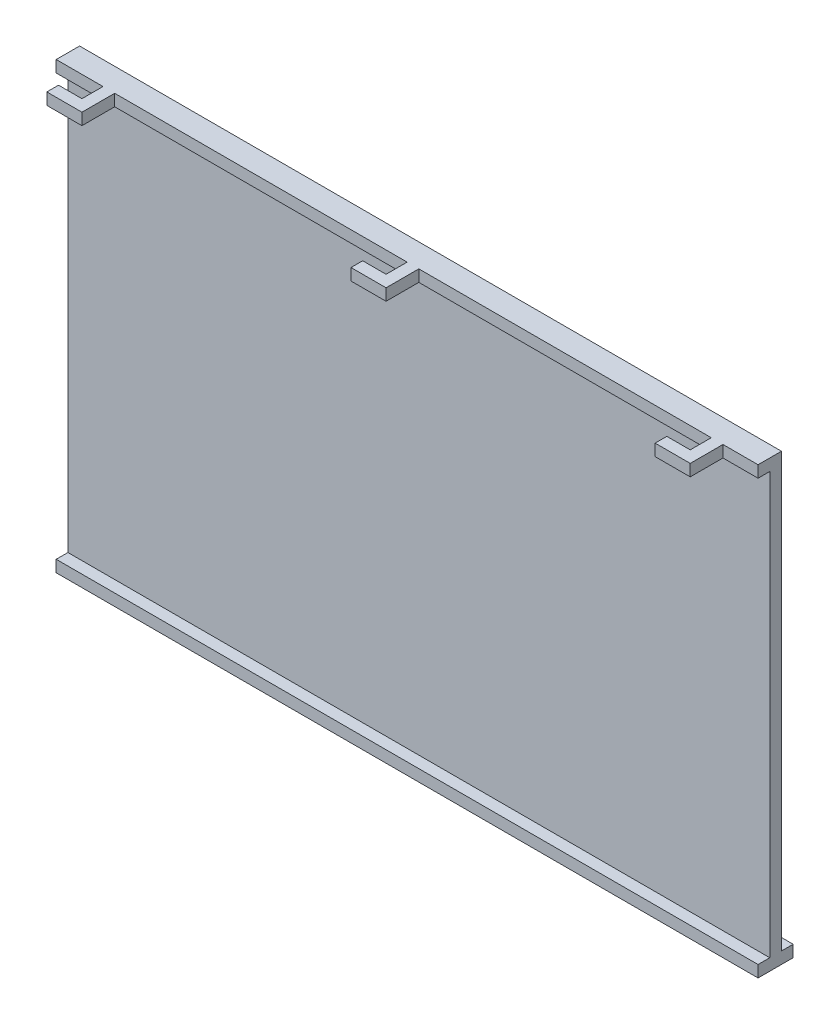
ISO-10303-21;
HEADER;
FILE_DESCRIPTION(('STEP AP214'),'2;1');
FILE_NAME('part.step','',(''),(''),'','','');
FILE_SCHEMA(('AUTOMOTIVE_DESIGN { 1 0 10303 214 1 1 1 1 }'));
ENDSEC;
DATA;
#1=APPLICATION_CONTEXT('core data for automotive mechanical design processes');
#2=APPLICATION_PROTOCOL_DEFINITION('international standard','automotive_design',2000,#1);
#3=PRODUCT_CONTEXT('',#1,'mechanical');
#4=PRODUCT('Part','Part','',(#3));
#5=PRODUCT_RELATED_PRODUCT_CATEGORY('part','',(#4));
#6=PRODUCT_DEFINITION_FORMATION('','',#4);
#7=PRODUCT_DEFINITION_CONTEXT('part definition',#1,'design');
#8=PRODUCT_DEFINITION('design','',#6,#7);
#9=PRODUCT_DEFINITION_SHAPE('','',#8);
#10=(LENGTH_UNIT() NAMED_UNIT(*) SI_UNIT(.MILLI.,.METRE.));
#11=(NAMED_UNIT(*) PLANE_ANGLE_UNIT() SI_UNIT($,.RADIAN.));
#12=(NAMED_UNIT(*) SI_UNIT($,.STERADIAN.) SOLID_ANGLE_UNIT());
#13=UNCERTAINTY_MEASURE_WITH_UNIT(LENGTH_MEASURE(1.E-05),#10,'distance_accuracy_value','');
#14=(GEOMETRIC_REPRESENTATION_CONTEXT(3) GLOBAL_UNCERTAINTY_ASSIGNED_CONTEXT((#13)) GLOBAL_UNIT_ASSIGNED_CONTEXT((#10,
#11,#12)) REPRESENTATION_CONTEXT('',''));
#15=CARTESIAN_POINT('',(0.,0.,0.));
#16=DIRECTION('',(0.,0.,1.));
#17=DIRECTION('',(1.,0.,0.));
#18=AXIS2_PLACEMENT_3D('',#15,#16,#17);
#19=CARTESIAN_POINT('',(150.,0.,7.50000000000003));
#20=DIRECTION('',(0.,0.,-1.));
#21=DIRECTION('',(-1.,0.,0.));
#22=AXIS2_PLACEMENT_3D('',#19,#20,#21);
#23=PLANE('',#22);
#24=DIRECTION('',(-1.,0.,0.));
#25=VECTOR('',#24,1.);
#26=CARTESIAN_POINT('',(150.,190.,7.50000000000003));
#27=LINE('',#26,#25);
#28=CARTESIAN_POINT('',(0.,190.,7.50000000000091));
#29=VERTEX_POINT('',#28);
#30=CARTESIAN_POINT('',(-125.,190.,7.50000000000182));
#31=VERTEX_POINT('',#30);
#32=EDGE_CURVE('E585',#29,#31,#27,.T.);
#33=ORIENTED_EDGE('',*,*,#32,.T.);
#34=DIRECTION('',(0.,1.,0.));
#35=VECTOR('',#34,1.);
#36=CARTESIAN_POINT('',(-125.,185.,7.50000000000182));
#37=LINE('',#36,#35);
#38=CARTESIAN_POINT('',(-125.,185.,7.50000000000182));
#39=VERTEX_POINT('',#38);
#40=EDGE_CURVE('E286',#39,#31,#37,.T.);
#41=ORIENTED_EDGE('',*,*,#40,.F.);
#42=DIRECTION('',(-1.,0.,0.));
#43=VECTOR('',#42,1.);
#44=CARTESIAN_POINT('',(150.,185.,7.50000000000003));
#45=LINE('',#44,#43);
#46=CARTESIAN_POINT('',(0.,185.,7.50000000000003));
#47=VERTEX_POINT('',#46);
#48=EDGE_CURVE('E580',#47,#39,#45,.T.);
#49=ORIENTED_EDGE('',*,*,#48,.F.);
#50=DIRECTION('',(0.,1.,0.));
#51=VECTOR('',#50,1.);
#52=CARTESIAN_POINT('',(0.,185.,7.50000000000091));
#53=LINE('',#52,#51);
#54=EDGE_CURVE('E331',#47,#29,#53,.T.);
#55=ORIENTED_EDGE('',*,*,#54,.T.);
#56=EDGE_LOOP('',(#33,#41,#49,#55));
#57=FACE_BOUND('',#56,.T.);
#58=ADVANCED_FACE('F81',(#57),#23,.F.);
#59=CARTESIAN_POINT('',(130.,190.,7.50000000000001));
#60=VERTEX_POINT('',#59);
#61=CARTESIAN_POINT('',(5.,190.,7.50000000000091));
#62=VERTEX_POINT('',#61);
#63=EDGE_CURVE('E517',#60,#62,#27,.T.);
#64=ORIENTED_EDGE('',*,*,#63,.T.);
#65=DIRECTION('',(0.,1.,0.));
#66=VECTOR('',#65,1.);
#67=CARTESIAN_POINT('',(5.,185.,7.50000000000091));
#68=LINE('',#67,#66);
#69=CARTESIAN_POINT('',(5.,185.,7.50000000000091));
#70=VERTEX_POINT('',#69);
#71=EDGE_CURVE('E327',#70,#62,#68,.T.);
#72=ORIENTED_EDGE('',*,*,#71,.F.);
#73=CARTESIAN_POINT('',(130.,185.,7.50000000000003));
#74=VERTEX_POINT('',#73);
#75=EDGE_CURVE('E511',#74,#70,#45,.T.);
#76=ORIENTED_EDGE('',*,*,#75,.F.);
#77=DIRECTION('',(0.,1.,0.));
#78=VECTOR('',#77,1.);
#79=CARTESIAN_POINT('',(130.,185.,7.50000000000001));
#80=LINE('',#79,#78);
#81=EDGE_CURVE('E403',#74,#60,#80,.T.);
#82=ORIENTED_EDGE('',*,*,#81,.T.);
#83=EDGE_LOOP('',(#64,#72,#76,#82));
#84=FACE_BOUND('',#83,.T.);
#85=ADVANCED_FACE('F593',(#84),#23,.F.);
#86=CARTESIAN_POINT('',(150.,190.,7.50000000000003));
#87=VERTEX_POINT('',#86);
#88=CARTESIAN_POINT('',(135.,190.,7.50000000000001));
#89=VERTEX_POINT('',#88);
#90=EDGE_CURVE('E512',#87,#89,#27,.T.);
#91=ORIENTED_EDGE('',*,*,#90,.T.);
#92=DIRECTION('',(0.,1.,0.));
#93=VECTOR('',#92,1.);
#94=CARTESIAN_POINT('',(135.,185.,7.50000000000001));
#95=LINE('',#94,#93);
#96=CARTESIAN_POINT('',(135.,185.,7.50000000000001));
#97=VERTEX_POINT('',#96);
#98=EDGE_CURVE('E422',#97,#89,#95,.T.);
#99=ORIENTED_EDGE('',*,*,#98,.F.);
#100=CARTESIAN_POINT('',(150.,185.,7.50000000000003));
#101=VERTEX_POINT('',#100);
#102=EDGE_CURVE('E506',#101,#97,#45,.T.);
#103=ORIENTED_EDGE('',*,*,#102,.F.);
#104=DIRECTION('',(0.,-1.,0.));
#105=VECTOR('',#104,1.);
#106=CARTESIAN_POINT('',(150.,0.,7.50000000000003));
#107=LINE('',#106,#105);
#108=EDGE_CURVE('E460',#87,#101,#107,.T.);
#109=ORIENTED_EDGE('',*,*,#108,.F.);
#110=EDGE_LOOP('',(#91,#99,#103,#109));
#111=FACE_BOUND('',#110,.T.);
#112=ADVANCED_FACE('F647',(#111),#23,.F.);
#113=CARTESIAN_POINT('',(150.,0.,-7.50000000000002));
#114=DIRECTION('',(0.,0.,1.));
#115=DIRECTION('',(1.,0.,0.));
#116=AXIS2_PLACEMENT_3D('',#113,#114,#115);
#117=PLANE('',#116);
#118=DIRECTION('',(0.,1.,0.));
#119=VECTOR('',#118,1.);
#120=CARTESIAN_POINT('',(-150.,0.,-7.50000000000002));
#121=LINE('',#120,#119);
#122=CARTESIAN_POINT('',(-150.,0.,-7.50000000000002));
#123=VERTEX_POINT('',#122);
#124=CARTESIAN_POINT('',(-150.,5.00000000000001,-7.50000000000002));
#125=VERTEX_POINT('',#124);
#126=EDGE_CURVE('E475',#123,#125,#121,.T.);
#127=ORIENTED_EDGE('',*,*,#126,.T.);
#128=DIRECTION('',(-1.,0.,0.));
#129=VECTOR('',#128,1.);
#130=CARTESIAN_POINT('',(150.,5.00000000000001,-7.50000000000002));
#131=LINE('',#130,#129);
#132=CARTESIAN_POINT('',(150.,5.00000000000001,-7.50000000000002));
#133=VERTEX_POINT('',#132);
#134=EDGE_CURVE('E523',#133,#125,#131,.T.);
#135=ORIENTED_EDGE('',*,*,#134,.F.);
#136=DIRECTION('',(0.,1.,0.));
#137=VECTOR('',#136,1.);
#138=CARTESIAN_POINT('',(150.,0.,-7.50000000000002));
#139=LINE('',#138,#137);
#140=CARTESIAN_POINT('',(150.,0.,-7.50000000000002));
#141=VERTEX_POINT('',#140);
#142=EDGE_CURVE('E445',#141,#133,#139,.T.);
#143=ORIENTED_EDGE('',*,*,#142,.F.);
#144=DIRECTION('',(-1.,0.,0.));
#145=VECTOR('',#144,1.);
#146=CARTESIAN_POINT('',(150.,0.,-7.50000000000002));
#147=LINE('',#146,#145);
#148=EDGE_CURVE('E91',#141,#123,#147,.T.);
#149=ORIENTED_EDGE('',*,*,#148,.T.);
#150=EDGE_LOOP('',(#127,#135,#143,#149));
#151=FACE_BOUND('',#150,.T.);
#152=ADVANCED_FACE('F561',(#151),#117,.F.);
#153=CARTESIAN_POINT('',(150.,5.,0.));
#154=DIRECTION('',(0.,1.,0.));
#155=DIRECTION('',(0.,0.,1.));
#156=AXIS2_PLACEMENT_3D('',#153,#154,#155);
#157=PLANE('',#156);
#158=DIRECTION('',(0.,0.,-1.));
#159=VECTOR('',#158,1.);
#160=CARTESIAN_POINT('',(-150.,5.,0.));
#161=LINE('',#160,#159);
#162=CARTESIAN_POINT('',(-150.,5.,-2.50000000000003));
#163=VERTEX_POINT('',#162);
#164=EDGE_CURVE('E480',#163,#125,#161,.T.);
#165=ORIENTED_EDGE('',*,*,#164,.F.);
#166=DIRECTION('',(-1.,0.,0.));
#167=VECTOR('',#166,1.);
#168=CARTESIAN_POINT('',(150.,5.,-2.50000000000003));
#169=LINE('',#168,#167);
#170=CARTESIAN_POINT('',(150.,5.,-2.50000000000003));
#171=VERTEX_POINT('',#170);
#172=EDGE_CURVE('E520',#171,#163,#169,.T.);
#173=ORIENTED_EDGE('',*,*,#172,.F.);
#174=DIRECTION('',(0.,0.,-1.));
#175=VECTOR('',#174,1.);
#176=CARTESIAN_POINT('',(150.,5.,0.));
#177=LINE('',#176,#175);
#178=EDGE_CURVE('E449',#171,#133,#177,.T.);
#179=ORIENTED_EDGE('',*,*,#178,.T.);
#180=ORIENTED_EDGE('',*,*,#134,.T.);
#181=EDGE_LOOP('',(#165,#173,#179,#180));
#182=FACE_BOUND('',#181,.T.);
#183=ADVANCED_FACE('F661',(#182),#157,.T.);
#184=CARTESIAN_POINT('',(150.,0.,-2.50000000000003));
#185=DIRECTION('',(0.,0.,1.));
#186=DIRECTION('',(0.,-1.,0.));
#187=AXIS2_PLACEMENT_3D('',#184,#185,#186);
#188=PLANE('',#187);
#189=DIRECTION('',(0.,1.,0.));
#190=VECTOR('',#189,1.);
#191=CARTESIAN_POINT('',(-150.,0.,-2.50000000000003));
#192=LINE('',#191,#190);
#193=CARTESIAN_POINT('',(-150.,190.,-2.49999999999997));
#194=VERTEX_POINT('',#193);
#195=EDGE_CURVE('E484',#163,#194,#192,.T.);
#196=ORIENTED_EDGE('',*,*,#195,.T.);
#197=DIRECTION('',(-1.,0.,0.));
#198=VECTOR('',#197,1.);
#199=CARTESIAN_POINT('',(150.,190.,-2.49999999999997));
#200=LINE('',#199,#198);
#201=CARTESIAN_POINT('',(150.,190.,-2.49999999999997));
#202=VERTEX_POINT('',#201);
#203=EDGE_CURVE('E516',#202,#194,#200,.T.);
#204=ORIENTED_EDGE('',*,*,#203,.F.);
#205=DIRECTION('',(0.,1.,0.));
#206=VECTOR('',#205,1.);
#207=CARTESIAN_POINT('',(150.,0.,-2.50000000000003));
#208=LINE('',#207,#206);
#209=EDGE_CURVE('E453',#171,#202,#208,.T.);
#210=ORIENTED_EDGE('',*,*,#209,.F.);
#211=ORIENTED_EDGE('',*,*,#172,.T.);
#212=EDGE_LOOP('',(#196,#204,#210,#211));
#213=FACE_BOUND('',#212,.T.);
#214=ADVANCED_FACE('F655',(#213),#188,.F.);
#215=CARTESIAN_POINT('',(150.,190.,0.));
#216=DIRECTION('',(0.,1.,0.));
#217=DIRECTION('',(0.,0.,1.));
#218=AXIS2_PLACEMENT_3D('',#215,#216,#217);
#219=PLANE('',#218);
#220=DIRECTION('',(0.,0.,-1.));
#221=VECTOR('',#220,1.);
#222=CARTESIAN_POINT('',(-150.,190.,0.));
#223=LINE('',#222,#221);
#224=CARTESIAN_POINT('',(-150.,190.,7.50000000000003));
#225=VERTEX_POINT('',#224);
#226=EDGE_CURVE('E488',#225,#194,#223,.T.);
#227=ORIENTED_EDGE('',*,*,#226,.F.);
#228=CARTESIAN_POINT('',(-130.,190.,7.50000000000182));
#229=VERTEX_POINT('',#228);
#230=EDGE_CURVE('E510',#229,#225,#27,.T.);
#231=ORIENTED_EDGE('',*,*,#230,.F.);
#232=DIRECTION('',(0.,0.,1.));
#233=VECTOR('',#232,1.);
#234=CARTESIAN_POINT('',(-130.,190.,16.5000000000018));
#235=LINE('',#234,#233);
#236=CARTESIAN_POINT('',(-130.,190.,16.5000000000018));
#237=VERTEX_POINT('',#236);
#238=EDGE_CURVE('E292',#229,#237,#235,.T.);
#239=ORIENTED_EDGE('',*,*,#238,.T.);
#240=DIRECTION('',(-1.,0.,0.));
#241=VECTOR('',#240,1.);
#242=CARTESIAN_POINT('',(-140.,190.,16.5000000000018));
#243=LINE('',#242,#241);
#244=CARTESIAN_POINT('',(-140.,190.,16.5000000000018));
#245=VERTEX_POINT('',#244);
#246=EDGE_CURVE('E305',#237,#245,#243,.T.);
#247=ORIENTED_EDGE('',*,*,#246,.T.);
#248=DIRECTION('',(0.,0.,1.));
#249=VECTOR('',#248,1.);
#250=CARTESIAN_POINT('',(-140.,190.,21.5000000000018));
#251=LINE('',#250,#249);
#252=CARTESIAN_POINT('',(-140.,190.,21.5000000000018));
#253=VERTEX_POINT('',#252);
#254=EDGE_CURVE('E299',#245,#253,#251,.T.);
#255=ORIENTED_EDGE('',*,*,#254,.T.);
#256=DIRECTION('',(1.,0.,0.));
#257=VECTOR('',#256,1.);
#258=CARTESIAN_POINT('',(-125.,190.,21.5000000000018));
#259=LINE('',#258,#257);
#260=CARTESIAN_POINT('',(-125.,190.,21.5000000000018));
#261=VERTEX_POINT('',#260);
#262=EDGE_CURVE('E274',#253,#261,#259,.T.);
#263=ORIENTED_EDGE('',*,*,#262,.T.);
#264=DIRECTION('',(0.,0.,-1.));
#265=VECTOR('',#264,1.);
#266=CARTESIAN_POINT('',(-125.,190.,7.50000000000182));
#267=LINE('',#266,#265);
#268=EDGE_CURVE('E283',#261,#31,#267,.T.);
#269=ORIENTED_EDGE('',*,*,#268,.T.);
#270=ORIENTED_EDGE('',*,*,#32,.F.);
#271=DIRECTION('',(0.,0.,1.));
#272=VECTOR('',#271,1.);
#273=CARTESIAN_POINT('',(0.,190.,16.5000000000009));
#274=LINE('',#273,#272);
#275=CARTESIAN_POINT('',(0.,190.,16.5000000000009));
#276=VERTEX_POINT('',#275);
#277=EDGE_CURVE('E359',#29,#276,#274,.T.);
#278=ORIENTED_EDGE('',*,*,#277,.T.);
#279=DIRECTION('',(-1.,0.,0.));
#280=VECTOR('',#279,1.);
#281=CARTESIAN_POINT('',(-9.99999999999999,190.,16.5000000000009));
#282=LINE('',#281,#280);
#283=CARTESIAN_POINT('',(-9.99999999999999,190.,16.5000000000009));
#284=VERTEX_POINT('',#283);
#285=EDGE_CURVE('E355',#276,#284,#282,.T.);
#286=ORIENTED_EDGE('',*,*,#285,.T.);
#287=DIRECTION('',(0.,0.,1.));
#288=VECTOR('',#287,1.);
#289=CARTESIAN_POINT('',(-9.99999999999999,190.,21.5000000000009));
#290=LINE('',#289,#288);
#291=CARTESIAN_POINT('',(-9.99999999999999,190.,21.5000000000009));
#292=VERTEX_POINT('',#291);
#293=EDGE_CURVE('E350',#284,#292,#290,.T.);
#294=ORIENTED_EDGE('',*,*,#293,.T.);
#295=DIRECTION('',(1.,0.,0.));
#296=VECTOR('',#295,1.);
#297=CARTESIAN_POINT('',(5.,190.,21.5000000000009));
#298=LINE('',#297,#296);
#299=CARTESIAN_POINT('',(5.,190.,21.5000000000009));
#300=VERTEX_POINT('',#299);
#301=EDGE_CURVE('E346',#292,#300,#298,.T.);
#302=ORIENTED_EDGE('',*,*,#301,.T.);
#303=DIRECTION('',(0.,0.,-1.));
#304=VECTOR('',#303,1.);
#305=CARTESIAN_POINT('',(5.,190.,7.50000000000091));
#306=LINE('',#305,#304);
#307=EDGE_CURVE('E363',#300,#62,#306,.T.);
#308=ORIENTED_EDGE('',*,*,#307,.T.);
#309=ORIENTED_EDGE('',*,*,#63,.F.);
#310=DIRECTION('',(0.,0.,1.));
#311=VECTOR('',#310,1.);
#312=CARTESIAN_POINT('',(130.,190.,16.5));
#313=LINE('',#312,#311);
#314=CARTESIAN_POINT('',(130.,190.,16.5));
#315=VERTEX_POINT('',#314);
#316=EDGE_CURVE('E367',#60,#315,#313,.T.);
#317=ORIENTED_EDGE('',*,*,#316,.T.);
#318=DIRECTION('',(-1.,0.,0.));
#319=VECTOR('',#318,1.);
#320=CARTESIAN_POINT('',(120.,190.,16.5));
#321=LINE('',#320,#319);
#322=CARTESIAN_POINT('',(120.,190.,16.5));
#323=VERTEX_POINT('',#322);
#324=EDGE_CURVE('E407',#315,#323,#321,.T.);
#325=ORIENTED_EDGE('',*,*,#324,.T.);
#326=DIRECTION('',(0.,0.,1.));
#327=VECTOR('',#326,1.);
#328=CARTESIAN_POINT('',(120.,190.,21.5));
#329=LINE('',#328,#327);
#330=CARTESIAN_POINT('',(120.,190.,21.5));
#331=VERTEX_POINT('',#330);
#332=EDGE_CURVE('E411',#323,#331,#329,.T.);
#333=ORIENTED_EDGE('',*,*,#332,.T.);
#334=DIRECTION('',(1.,0.,0.));
#335=VECTOR('',#334,1.);
#336=CARTESIAN_POINT('',(135.,190.,21.5));
#337=LINE('',#336,#335);
#338=CARTESIAN_POINT('',(135.,190.,21.5));
#339=VERTEX_POINT('',#338);
#340=EDGE_CURVE('E415',#331,#339,#337,.T.);
#341=ORIENTED_EDGE('',*,*,#340,.T.);
#342=DIRECTION('',(0.,0.,-1.));
#343=VECTOR('',#342,1.);
#344=CARTESIAN_POINT('',(135.,190.,7.50000000000001));
#345=LINE('',#344,#343);
#346=EDGE_CURVE('E388',#339,#89,#345,.T.);
#347=ORIENTED_EDGE('',*,*,#346,.T.);
#348=ORIENTED_EDGE('',*,*,#90,.F.);
#349=DIRECTION('',(0.,0.,-1.));
#350=VECTOR('',#349,1.);
#351=CARTESIAN_POINT('',(150.,190.,0.));
#352=LINE('',#351,#350);
#353=EDGE_CURVE('E456',#87,#202,#352,.T.);
#354=ORIENTED_EDGE('',*,*,#353,.T.);
#355=ORIENTED_EDGE('',*,*,#203,.T.);
#356=EDGE_LOOP('',(#227,#231,#239,#247,#255,#263,#269,#270,#278,#286,#294,#302,#308,#309,#317,
#325,#333,#341,#347,#348,#354,#355));
#357=FACE_BOUND('',#356,.T.);
#358=ADVANCED_FACE('F296',(#357),#219,.T.);
#359=CARTESIAN_POINT('',(-130.,185.,7.50000000000003));
#360=VERTEX_POINT('',#359);
#361=CARTESIAN_POINT('',(-150.,185.,7.50000000000003));
#362=VERTEX_POINT('',#361);
#363=EDGE_CURVE('E505',#360,#362,#45,.T.);
#364=ORIENTED_EDGE('',*,*,#363,.F.);
#365=DIRECTION('',(0.,1.,0.));
#366=VECTOR('',#365,1.);
#367=CARTESIAN_POINT('',(-130.,185.,7.50000000000182));
#368=LINE('',#367,#366);
#369=EDGE_CURVE('E583',#360,#229,#368,.T.);
#370=ORIENTED_EDGE('',*,*,#369,.T.);
#371=ORIENTED_EDGE('',*,*,#230,.T.);
#372=DIRECTION('',(0.,-1.,0.));
#373=VECTOR('',#372,1.);
#374=CARTESIAN_POINT('',(-150.,0.,7.50000000000003));
#375=LINE('',#374,#373);
#376=EDGE_CURVE('E492',#225,#362,#375,.T.);
#377=ORIENTED_EDGE('',*,*,#376,.T.);
#378=EDGE_LOOP('',(#364,#370,#371,#377));
#379=FACE_BOUND('',#378,.T.);
#380=ADVANCED_FACE('F581',(#379),#23,.F.);
#381=CARTESIAN_POINT('',(150.,185.,0.));
#382=DIRECTION('',(0.,-1.,0.));
#383=DIRECTION('',(0.,0.,-1.));
#384=AXIS2_PLACEMENT_3D('',#381,#382,#383);
#385=PLANE('',#384);
#386=DIRECTION('',(0.,0.,1.));
#387=VECTOR('',#386,1.);
#388=CARTESIAN_POINT('',(-150.,185.,0.));
#389=LINE('',#388,#387);
#390=CARTESIAN_POINT('',(-150.,185.,2.50000000000003));
#391=VERTEX_POINT('',#390);
#392=EDGE_CURVE('E496',#391,#362,#389,.T.);
#393=ORIENTED_EDGE('',*,*,#392,.F.);
#394=DIRECTION('',(-1.,0.,0.));
#395=VECTOR('',#394,1.);
#396=CARTESIAN_POINT('',(150.,185.,2.50000000000003));
#397=LINE('',#396,#395);
#398=CARTESIAN_POINT('',(150.,185.,2.50000000000003));
#399=VERTEX_POINT('',#398);
#400=EDGE_CURVE('E470',#399,#391,#397,.T.);
#401=ORIENTED_EDGE('',*,*,#400,.F.);
#402=DIRECTION('',(0.,0.,1.));
#403=VECTOR('',#402,1.);
#404=CARTESIAN_POINT('',(150.,185.,0.));
#405=LINE('',#404,#403);
#406=EDGE_CURVE('E463',#399,#101,#405,.T.);
#407=ORIENTED_EDGE('',*,*,#406,.T.);
#408=ORIENTED_EDGE('',*,*,#102,.T.);
#409=DIRECTION('',(0.,0.,-1.));
#410=VECTOR('',#409,1.);
#411=CARTESIAN_POINT('',(135.,185.,7.50000000000001));
#412=LINE('',#411,#410);
#413=CARTESIAN_POINT('',(135.,185.,21.5));
#414=VERTEX_POINT('',#413);
#415=EDGE_CURVE('E400',#414,#97,#412,.T.);
#416=ORIENTED_EDGE('',*,*,#415,.F.);
#417=DIRECTION('',(1.,0.,0.));
#418=VECTOR('',#417,1.);
#419=CARTESIAN_POINT('',(135.,185.,21.5));
#420=LINE('',#419,#418);
#421=CARTESIAN_POINT('',(120.,185.,21.5));
#422=VERTEX_POINT('',#421);
#423=EDGE_CURVE('E396',#422,#414,#420,.T.);
#424=ORIENTED_EDGE('',*,*,#423,.F.);
#425=DIRECTION('',(0.,0.,1.));
#426=VECTOR('',#425,1.);
#427=CARTESIAN_POINT('',(120.,185.,21.5));
#428=LINE('',#427,#426);
#429=CARTESIAN_POINT('',(120.,185.,16.5));
#430=VERTEX_POINT('',#429);
#431=EDGE_CURVE('E392',#430,#422,#428,.T.);
#432=ORIENTED_EDGE('',*,*,#431,.F.);
#433=DIRECTION('',(-1.,0.,0.));
#434=VECTOR('',#433,1.);
#435=CARTESIAN_POINT('',(120.,185.,16.5));
#436=LINE('',#435,#434);
#437=CARTESIAN_POINT('',(130.,185.,16.5));
#438=VERTEX_POINT('',#437);
#439=EDGE_CURVE('E387',#438,#430,#436,.T.);
#440=ORIENTED_EDGE('',*,*,#439,.F.);
#441=DIRECTION('',(0.,0.,1.));
#442=VECTOR('',#441,1.);
#443=CARTESIAN_POINT('',(130.,185.,16.5));
#444=LINE('',#443,#442);
#445=EDGE_CURVE('E383',#74,#438,#444,.T.);
#446=ORIENTED_EDGE('',*,*,#445,.F.);
#447=ORIENTED_EDGE('',*,*,#75,.T.);
#448=DIRECTION('',(0.,0.,-1.));
#449=VECTOR('',#448,1.);
#450=CARTESIAN_POINT('',(5.,185.,7.50000000000091));
#451=LINE('',#450,#449);
#452=CARTESIAN_POINT('',(5.,185.,21.5000000000009));
#453=VERTEX_POINT('',#452);
#454=EDGE_CURVE('E351',#453,#70,#451,.T.);
#455=ORIENTED_EDGE('',*,*,#454,.F.);
#456=DIRECTION('',(1.,0.,0.));
#457=VECTOR('',#456,1.);
#458=CARTESIAN_POINT('',(5.,185.,21.5000000000009));
#459=LINE('',#458,#457);
#460=CARTESIAN_POINT('',(-9.99999999999999,185.,21.5000000000009));
#461=VERTEX_POINT('',#460);
#462=EDGE_CURVE('E330',#461,#453,#459,.T.);
#463=ORIENTED_EDGE('',*,*,#462,.F.);
#464=DIRECTION('',(0.,0.,1.));
#465=VECTOR('',#464,1.);
#466=CARTESIAN_POINT('',(-9.99999999999999,185.,21.5000000000009));
#467=LINE('',#466,#465);
#468=CARTESIAN_POINT('',(-9.99999999999999,185.,16.5000000000009));
#469=VERTEX_POINT('',#468);
#470=EDGE_CURVE('E371',#469,#461,#467,.T.);
#471=ORIENTED_EDGE('',*,*,#470,.F.);
#472=DIRECTION('',(-1.,0.,0.));
#473=VECTOR('',#472,1.);
#474=CARTESIAN_POINT('',(-9.99999999999999,185.,16.5000000000009));
#475=LINE('',#474,#473);
#476=CARTESIAN_POINT('',(0.,185.,16.5000000000009));
#477=VERTEX_POINT('',#476);
#478=EDGE_CURVE('E375',#477,#469,#475,.T.);
#479=ORIENTED_EDGE('',*,*,#478,.F.);
#480=DIRECTION('',(0.,0.,1.));
#481=VECTOR('',#480,1.);
#482=CARTESIAN_POINT('',(0.,185.,16.5000000000009));
#483=LINE('',#482,#481);
#484=EDGE_CURVE('E106',#47,#477,#483,.T.);
#485=ORIENTED_EDGE('',*,*,#484,.F.);
#486=ORIENTED_EDGE('',*,*,#48,.T.);
#487=DIRECTION('',(0.,0.,-1.));
#488=VECTOR('',#487,1.);
#489=CARTESIAN_POINT('',(-125.,185.,7.50000000000182));
#490=LINE('',#489,#488);
#491=CARTESIAN_POINT('',(-125.,185.,21.5000000000018));
#492=VERTEX_POINT('',#491);
#493=EDGE_CURVE('E301',#492,#39,#490,.T.);
#494=ORIENTED_EDGE('',*,*,#493,.F.);
#495=DIRECTION('',(1.,0.,0.));
#496=VECTOR('',#495,1.);
#497=CARTESIAN_POINT('',(-125.,185.,21.5000000000018));
#498=LINE('',#497,#496);
#499=CARTESIAN_POINT('',(-140.,185.,21.5000000000018));
#500=VERTEX_POINT('',#499);
#501=EDGE_CURVE('E276',#500,#492,#498,.T.);
#502=ORIENTED_EDGE('',*,*,#501,.F.);
#503=DIRECTION('',(0.,0.,1.));
#504=VECTOR('',#503,1.);
#505=CARTESIAN_POINT('',(-140.,185.,21.5000000000018));
#506=LINE('',#505,#504);
#507=CARTESIAN_POINT('',(-140.,185.,16.5000000000018));
#508=VERTEX_POINT('',#507);
#509=EDGE_CURVE('E317',#508,#500,#506,.T.);
#510=ORIENTED_EDGE('',*,*,#509,.F.);
#511=DIRECTION('',(-1.,0.,0.));
#512=VECTOR('',#511,1.);
#513=CARTESIAN_POINT('',(-140.,185.,16.5000000000018));
#514=LINE('',#513,#512);
#515=CARTESIAN_POINT('',(-130.,185.,16.5000000000018));
#516=VERTEX_POINT('',#515);
#517=EDGE_CURVE('E321',#516,#508,#514,.T.);
#518=ORIENTED_EDGE('',*,*,#517,.F.);
#519=DIRECTION('',(0.,0.,1.));
#520=VECTOR('',#519,1.);
#521=CARTESIAN_POINT('',(-130.,185.,16.5000000000018));
#522=LINE('',#521,#520);
#523=EDGE_CURVE('E99',#360,#516,#522,.T.);
#524=ORIENTED_EDGE('',*,*,#523,.F.);
#525=ORIENTED_EDGE('',*,*,#363,.T.);
#526=EDGE_LOOP('',(#393,#401,#407,#408,#416,#424,#432,#440,#446,#447,#455,#463,#471,#479,#485,
#486,#494,#502,#510,#518,#524,#525));
#527=FACE_BOUND('',#526,.T.);
#528=ADVANCED_FACE('F575',(#527),#385,.T.);
#529=CARTESIAN_POINT('',(150.,0.,2.5));
#530=DIRECTION('',(0.,0.,1.));
#531=DIRECTION('',(0.,-1.,0.));
#532=AXIS2_PLACEMENT_3D('',#529,#530,#531);
#533=PLANE('',#532);
#534=DIRECTION('',(0.,1.,0.));
#535=VECTOR('',#534,1.);
#536=CARTESIAN_POINT('',(-150.,0.,2.5));
#537=LINE('',#536,#535);
#538=CARTESIAN_POINT('',(-150.,5.,2.5));
#539=VERTEX_POINT('',#538);
#540=EDGE_CURVE('E446',#539,#391,#537,.T.);
#541=ORIENTED_EDGE('',*,*,#540,.F.);
#542=DIRECTION('',(1.,0.,0.));
#543=VECTOR('',#542,1.);
#544=CARTESIAN_POINT('',(150.,5.,2.5));
#545=LINE('',#544,#543);
#546=CARTESIAN_POINT('',(150.,5.,2.5));
#547=VERTEX_POINT('',#546);
#548=EDGE_CURVE('E12',#539,#547,#545,.T.);
#549=ORIENTED_EDGE('',*,*,#548,.T.);
#550=DIRECTION('',(0.,1.,0.));
#551=VECTOR('',#550,1.);
#552=CARTESIAN_POINT('',(150.,0.,2.5));
#553=LINE('',#552,#551);
#554=EDGE_CURVE('E467',#547,#399,#553,.T.);
#555=ORIENTED_EDGE('',*,*,#554,.T.);
#556=ORIENTED_EDGE('',*,*,#400,.T.);
#557=EDGE_LOOP('',(#541,#549,#555,#556));
#558=FACE_BOUND('',#557,.T.);
#559=ADVANCED_FACE('F571',(#558),#533,.T.);
#560=CARTESIAN_POINT('',(150.,0.,0.));
#561=DIRECTION('',(0.,1.,0.));
#562=DIRECTION('',(0.,0.,1.));
#563=AXIS2_PLACEMENT_3D('',#560,#561,#562);
#564=PLANE('',#563);
#565=DIRECTION('',(0.,0.,-1.));
#566=VECTOR('',#565,1.);
#567=CARTESIAN_POINT('',(-150.,0.,0.));
#568=LINE('',#567,#566);
#569=CARTESIAN_POINT('',(-150.,0.,7.5));
#570=VERTEX_POINT('',#569);
#571=EDGE_CURVE('E471',#570,#123,#568,.T.);
#572=ORIENTED_EDGE('',*,*,#571,.T.);
#573=ORIENTED_EDGE('',*,*,#148,.F.);
#574=DIRECTION('',(0.,0.,-1.));
#575=VECTOR('',#574,1.);
#576=CARTESIAN_POINT('',(150.,0.,0.));
#577=LINE('',#576,#575);
#578=CARTESIAN_POINT('',(150.,0.,7.5));
#579=VERTEX_POINT('',#578);
#580=EDGE_CURVE('E441',#579,#141,#577,.T.);
#581=ORIENTED_EDGE('',*,*,#580,.F.);
#582=DIRECTION('',(-1.,0.,0.));
#583=VECTOR('',#582,1.);
#584=CARTESIAN_POINT('',(150.,0.,7.5));
#585=LINE('',#584,#583);
#586=EDGE_CURVE('E85',#579,#570,#585,.T.);
#587=ORIENTED_EDGE('',*,*,#586,.T.);
#588=EDGE_LOOP('',(#572,#573,#581,#587));
#589=FACE_BOUND('',#588,.T.);
#590=ADVANCED_FACE('F550',(#589),#564,.F.);
#591=CARTESIAN_POINT('',(-150.,0.,0.));
#592=DIRECTION('',(1.,0.,0.));
#593=DIRECTION('',(0.,0.,-1.));
#594=AXIS2_PLACEMENT_3D('',#591,#592,#593);
#595=PLANE('',#594);
#596=ORIENTED_EDGE('',*,*,#571,.F.);
#597=DIRECTION('',(0.,1.,0.));
#598=VECTOR('',#597,1.);
#599=CARTESIAN_POINT('',(-150.,0.,7.5));
#600=LINE('',#599,#598);
#601=CARTESIAN_POINT('',(-150.,5.,7.5));
#602=VERTEX_POINT('',#601);
#603=EDGE_CURVE('E425',#570,#602,#600,.T.);
#604=ORIENTED_EDGE('',*,*,#603,.T.);
#605=DIRECTION('',(0.,0.,1.));
#606=VECTOR('',#605,1.);
#607=CARTESIAN_POINT('',(-150.,5.,2.5));
#608=LINE('',#607,#606);
#609=EDGE_CURVE('E534',#539,#602,#608,.T.);
#610=ORIENTED_EDGE('',*,*,#609,.F.);
#611=ORIENTED_EDGE('',*,*,#540,.T.);
#612=ORIENTED_EDGE('',*,*,#392,.T.);
#613=ORIENTED_EDGE('',*,*,#376,.F.);
#614=ORIENTED_EDGE('',*,*,#226,.T.);
#615=ORIENTED_EDGE('',*,*,#195,.F.);
#616=ORIENTED_EDGE('',*,*,#164,.T.);
#617=ORIENTED_EDGE('',*,*,#126,.F.);
#618=EDGE_LOOP('',(#596,#604,#610,#611,#612,#613,#614,#615,#616,#617));
#619=FACE_BOUND('',#618,.T.);
#620=ADVANCED_FACE('F555',(#619),#595,.F.);
#621=CARTESIAN_POINT('',(150.,0.,0.));
#622=DIRECTION('',(1.,0.,0.));
#623=DIRECTION('',(0.,0.,-1.));
#624=AXIS2_PLACEMENT_3D('',#621,#622,#623);
#625=PLANE('',#624);
#626=ORIENTED_EDGE('',*,*,#580,.T.);
#627=ORIENTED_EDGE('',*,*,#142,.T.);
#628=ORIENTED_EDGE('',*,*,#178,.F.);
#629=ORIENTED_EDGE('',*,*,#209,.T.);
#630=ORIENTED_EDGE('',*,*,#353,.F.);
#631=ORIENTED_EDGE('',*,*,#108,.T.);
#632=ORIENTED_EDGE('',*,*,#406,.F.);
#633=ORIENTED_EDGE('',*,*,#554,.F.);
#634=DIRECTION('',(0.,0.,1.));
#635=VECTOR('',#634,1.);
#636=CARTESIAN_POINT('',(150.,5.,2.5));
#637=LINE('',#636,#635);
#638=CARTESIAN_POINT('',(150.,5.,7.5));
#639=VERTEX_POINT('',#638);
#640=EDGE_CURVE('E533',#547,#639,#637,.T.);
#641=ORIENTED_EDGE('',*,*,#640,.T.);
#642=DIRECTION('',(0.,1.,0.));
#643=VECTOR('',#642,1.);
#644=CARTESIAN_POINT('',(150.,0.,7.5));
#645=LINE('',#644,#643);
#646=EDGE_CURVE('E529',#579,#639,#645,.T.);
#647=ORIENTED_EDGE('',*,*,#646,.F.);
#648=EDGE_LOOP('',(#626,#627,#628,#629,#630,#631,#632,#633,#641,#647));
#649=FACE_BOUND('',#648,.T.);
#650=ADVANCED_FACE('F564',(#649),#625,.T.);
#651=CARTESIAN_POINT('',(150.,5.,2.5));
#652=DIRECTION('',(0.,-1.,0.));
#653=DIRECTION('',(0.,0.,-1.));
#654=AXIS2_PLACEMENT_3D('',#651,#652,#653);
#655=PLANE('',#654);
#656=ORIENTED_EDGE('',*,*,#609,.T.);
#657=DIRECTION('',(-1.,0.,0.));
#658=VECTOR('',#657,1.);
#659=CARTESIAN_POINT('',(150.,5.,7.5));
#660=LINE('',#659,#658);
#661=EDGE_CURVE('E476',#639,#602,#660,.T.);
#662=ORIENTED_EDGE('',*,*,#661,.F.);
#663=ORIENTED_EDGE('',*,*,#640,.F.);
#664=ORIENTED_EDGE('',*,*,#548,.F.);
#665=EDGE_LOOP('',(#656,#662,#663,#664));
#666=FACE_BOUND('',#665,.T.);
#667=ADVANCED_FACE('F569',(#666),#655,.F.);
#668=CARTESIAN_POINT('',(150.,0.,7.5));
#669=DIRECTION('',(0.,0.,1.));
#670=DIRECTION('',(1.,0.,0.));
#671=AXIS2_PLACEMENT_3D('',#668,#669,#670);
#672=PLANE('',#671);
#673=ORIENTED_EDGE('',*,*,#603,.F.);
#674=ORIENTED_EDGE('',*,*,#586,.F.);
#675=ORIENTED_EDGE('',*,*,#646,.T.);
#676=ORIENTED_EDGE('',*,*,#661,.T.);
#677=EDGE_LOOP('',(#673,#674,#675,#676));
#678=FACE_BOUND('',#677,.T.);
#679=ADVANCED_FACE('F83',(#678),#672,.T.);
#680=CARTESIAN_POINT('',(135.,185.,7.50000000000001));
#681=DIRECTION('',(1.,0.,0.));
#682=DIRECTION('',(0.,0.,-1.));
#683=AXIS2_PLACEMENT_3D('',#680,#681,#682);
#684=PLANE('',#683);
#685=ORIENTED_EDGE('',*,*,#346,.F.);
#686=DIRECTION('',(0.,1.,0.));
#687=VECTOR('',#686,1.);
#688=CARTESIAN_POINT('',(135.,185.,21.5));
#689=LINE('',#688,#687);
#690=EDGE_CURVE('E426',#414,#339,#689,.T.);
#691=ORIENTED_EDGE('',*,*,#690,.F.);
#692=ORIENTED_EDGE('',*,*,#415,.T.);
#693=ORIENTED_EDGE('',*,*,#98,.T.);
#694=EDGE_LOOP('',(#685,#691,#692,#693));
#695=FACE_BOUND('',#694,.T.);
#696=ADVANCED_FACE('F670',(#695),#684,.T.);
#697=CARTESIAN_POINT('',(135.,185.,21.5));
#698=DIRECTION('',(0.,0.,1.));
#699=DIRECTION('',(1.,0.,0.));
#700=AXIS2_PLACEMENT_3D('',#697,#698,#699);
#701=PLANE('',#700);
#702=ORIENTED_EDGE('',*,*,#340,.F.);
#703=DIRECTION('',(0.,1.,0.));
#704=VECTOR('',#703,1.);
#705=CARTESIAN_POINT('',(120.,185.,21.5));
#706=LINE('',#705,#704);
#707=EDGE_CURVE('E429',#422,#331,#706,.T.);
#708=ORIENTED_EDGE('',*,*,#707,.F.);
#709=ORIENTED_EDGE('',*,*,#423,.T.);
#710=ORIENTED_EDGE('',*,*,#690,.T.);
#711=EDGE_LOOP('',(#702,#708,#709,#710));
#712=FACE_BOUND('',#711,.T.);
#713=ADVANCED_FACE('F777',(#712),#701,.T.);
#714=CARTESIAN_POINT('',(120.,185.,21.5));
#715=DIRECTION('',(-1.,0.,0.));
#716=DIRECTION('',(0.,0.,1.));
#717=AXIS2_PLACEMENT_3D('',#714,#715,#716);
#718=PLANE('',#717);
#719=ORIENTED_EDGE('',*,*,#332,.F.);
#720=DIRECTION('',(0.,1.,0.));
#721=VECTOR('',#720,1.);
#722=CARTESIAN_POINT('',(120.,185.,16.5));
#723=LINE('',#722,#721);
#724=EDGE_CURVE('E432',#430,#323,#723,.T.);
#725=ORIENTED_EDGE('',*,*,#724,.F.);
#726=ORIENTED_EDGE('',*,*,#431,.T.);
#727=ORIENTED_EDGE('',*,*,#707,.T.);
#728=EDGE_LOOP('',(#719,#725,#726,#727));
#729=FACE_BOUND('',#728,.T.);
#730=ADVANCED_FACE('F786',(#729),#718,.T.);
#731=CARTESIAN_POINT('',(120.,185.,16.5));
#732=DIRECTION('',(0.,0.,-1.));
#733=DIRECTION('',(-1.,0.,0.));
#734=AXIS2_PLACEMENT_3D('',#731,#732,#733);
#735=PLANE('',#734);
#736=ORIENTED_EDGE('',*,*,#324,.F.);
#737=DIRECTION('',(0.,1.,0.));
#738=VECTOR('',#737,1.);
#739=CARTESIAN_POINT('',(130.,185.,16.5));
#740=LINE('',#739,#738);
#741=EDGE_CURVE('E435',#438,#315,#740,.T.);
#742=ORIENTED_EDGE('',*,*,#741,.F.);
#743=ORIENTED_EDGE('',*,*,#439,.T.);
#744=ORIENTED_EDGE('',*,*,#724,.T.);
#745=EDGE_LOOP('',(#736,#742,#743,#744));
#746=FACE_BOUND('',#745,.T.);
#747=ADVANCED_FACE('F797',(#746),#735,.T.);
#748=CARTESIAN_POINT('',(130.,185.,16.5));
#749=DIRECTION('',(-1.,0.,0.));
#750=DIRECTION('',(0.,0.,1.));
#751=AXIS2_PLACEMENT_3D('',#748,#749,#750);
#752=PLANE('',#751);
#753=ORIENTED_EDGE('',*,*,#316,.F.);
#754=ORIENTED_EDGE('',*,*,#81,.F.);
#755=ORIENTED_EDGE('',*,*,#445,.T.);
#756=ORIENTED_EDGE('',*,*,#741,.T.);
#757=EDGE_LOOP('',(#753,#754,#755,#756));
#758=FACE_BOUND('',#757,.T.);
#759=ADVANCED_FACE('F697',(#758),#752,.T.);
#760=CARTESIAN_POINT('',(5.,185.,7.50000000000091));
#761=DIRECTION('',(1.,0.,0.));
#762=DIRECTION('',(0.,0.,-1.));
#763=AXIS2_PLACEMENT_3D('',#760,#761,#762);
#764=PLANE('',#763);
#765=ORIENTED_EDGE('',*,*,#307,.F.);
#766=DIRECTION('',(0.,1.,0.));
#767=VECTOR('',#766,1.);
#768=CARTESIAN_POINT('',(5.,185.,21.5000000000009));
#769=LINE('',#768,#767);
#770=EDGE_CURVE('E291',#453,#300,#769,.T.);
#771=ORIENTED_EDGE('',*,*,#770,.F.);
#772=ORIENTED_EDGE('',*,*,#454,.T.);
#773=ORIENTED_EDGE('',*,*,#71,.T.);
#774=EDGE_LOOP('',(#765,#771,#772,#773));
#775=FACE_BOUND('',#774,.T.);
#776=ADVANCED_FACE('F600',(#775),#764,.T.);
#777=CARTESIAN_POINT('',(5.,185.,21.5000000000009));
#778=DIRECTION('',(0.,0.,1.));
#779=DIRECTION('',(1.,0.,0.));
#780=AXIS2_PLACEMENT_3D('',#777,#778,#779);
#781=PLANE('',#780);
#782=ORIENTED_EDGE('',*,*,#301,.F.);
#783=DIRECTION('',(0.,1.,0.));
#784=VECTOR('',#783,1.);
#785=CARTESIAN_POINT('',(-9.99999999999999,185.,21.5000000000009));
#786=LINE('',#785,#784);
#787=EDGE_CURVE('E341',#461,#292,#786,.T.);
#788=ORIENTED_EDGE('',*,*,#787,.F.);
#789=ORIENTED_EDGE('',*,*,#462,.T.);
#790=ORIENTED_EDGE('',*,*,#770,.T.);
#791=EDGE_LOOP('',(#782,#788,#789,#790));
#792=FACE_BOUND('',#791,.T.);
#793=ADVANCED_FACE('F605',(#792),#781,.T.);
#794=CARTESIAN_POINT('',(-9.99999999999999,185.,21.5000000000009));
#795=DIRECTION('',(-1.,0.,0.));
#796=DIRECTION('',(0.,0.,1.));
#797=AXIS2_PLACEMENT_3D('',#794,#795,#796);
#798=PLANE('',#797);
#799=ORIENTED_EDGE('',*,*,#293,.F.);
#800=DIRECTION('',(0.,1.,0.));
#801=VECTOR('',#800,1.);
#802=CARTESIAN_POINT('',(-9.99999999999999,185.,16.5000000000009));
#803=LINE('',#802,#801);
#804=EDGE_CURVE('E338',#469,#284,#803,.T.);
#805=ORIENTED_EDGE('',*,*,#804,.F.);
#806=ORIENTED_EDGE('',*,*,#470,.T.);
#807=ORIENTED_EDGE('',*,*,#787,.T.);
#808=EDGE_LOOP('',(#799,#805,#806,#807));
#809=FACE_BOUND('',#808,.T.);
#810=ADVANCED_FACE('F608',(#809),#798,.T.);
#811=CARTESIAN_POINT('',(-9.99999999999999,185.,16.5000000000009));
#812=DIRECTION('',(0.,0.,-1.));
#813=DIRECTION('',(-1.,0.,0.));
#814=AXIS2_PLACEMENT_3D('',#811,#812,#813);
#815=PLANE('',#814);
#816=ORIENTED_EDGE('',*,*,#285,.F.);
#817=DIRECTION('',(0.,1.,0.));
#818=VECTOR('',#817,1.);
#819=CARTESIAN_POINT('',(0.,185.,16.5000000000009));
#820=LINE('',#819,#818);
#821=EDGE_CURVE('E335',#477,#276,#820,.T.);
#822=ORIENTED_EDGE('',*,*,#821,.F.);
#823=ORIENTED_EDGE('',*,*,#478,.T.);
#824=ORIENTED_EDGE('',*,*,#804,.T.);
#825=EDGE_LOOP('',(#816,#822,#823,#824));
#826=FACE_BOUND('',#825,.T.);
#827=ADVANCED_FACE('F611',(#826),#815,.T.);
#828=CARTESIAN_POINT('',(0.,185.,16.5000000000009));
#829=DIRECTION('',(-1.,0.,0.));
#830=DIRECTION('',(0.,0.,1.));
#831=AXIS2_PLACEMENT_3D('',#828,#829,#830);
#832=PLANE('',#831);
#833=ORIENTED_EDGE('',*,*,#277,.F.);
#834=ORIENTED_EDGE('',*,*,#54,.F.);
#835=ORIENTED_EDGE('',*,*,#484,.T.);
#836=ORIENTED_EDGE('',*,*,#821,.T.);
#837=EDGE_LOOP('',(#833,#834,#835,#836));
#838=FACE_BOUND('',#837,.T.);
#839=ADVANCED_FACE('F613',(#838),#832,.T.);
#840=CARTESIAN_POINT('',(-125.,185.,7.50000000000182));
#841=DIRECTION('',(1.,0.,0.));
#842=DIRECTION('',(0.,0.,-1.));
#843=AXIS2_PLACEMENT_3D('',#840,#841,#842);
#844=PLANE('',#843);
#845=ORIENTED_EDGE('',*,*,#268,.F.);
#846=DIRECTION('',(0.,1.,0.));
#847=VECTOR('',#846,1.);
#848=CARTESIAN_POINT('',(-125.,185.,21.5000000000018));
#849=LINE('',#848,#847);
#850=EDGE_CURVE('E270',#492,#261,#849,.T.);
#851=ORIENTED_EDGE('',*,*,#850,.F.);
#852=ORIENTED_EDGE('',*,*,#493,.T.);
#853=ORIENTED_EDGE('',*,*,#40,.T.);
#854=EDGE_LOOP('',(#845,#851,#852,#853));
#855=FACE_BOUND('',#854,.T.);
#856=ADVANCED_FACE('F284',(#855),#844,.T.);
#857=CARTESIAN_POINT('',(-125.,185.,21.5000000000018));
#858=DIRECTION('',(0.,0.,1.));
#859=DIRECTION('',(1.,0.,0.));
#860=AXIS2_PLACEMENT_3D('',#857,#858,#859);
#861=PLANE('',#860);
#862=ORIENTED_EDGE('',*,*,#262,.F.);
#863=DIRECTION('',(0.,1.,0.));
#864=VECTOR('',#863,1.);
#865=CARTESIAN_POINT('',(-140.,185.,21.5000000000018));
#866=LINE('',#865,#864);
#867=EDGE_CURVE('E280',#500,#253,#866,.T.);
#868=ORIENTED_EDGE('',*,*,#867,.F.);
#869=ORIENTED_EDGE('',*,*,#501,.T.);
#870=ORIENTED_EDGE('',*,*,#850,.T.);
#871=EDGE_LOOP('',(#862,#868,#869,#870));
#872=FACE_BOUND('',#871,.T.);
#873=ADVANCED_FACE('F272',(#872),#861,.T.);
#874=CARTESIAN_POINT('',(-140.,185.,21.5000000000018));
#875=DIRECTION('',(-1.,0.,0.));
#876=DIRECTION('',(0.,0.,1.));
#877=AXIS2_PLACEMENT_3D('',#874,#875,#876);
#878=PLANE('',#877);
#879=ORIENTED_EDGE('',*,*,#254,.F.);
#880=DIRECTION('',(0.,1.,0.));
#881=VECTOR('',#880,1.);
#882=CARTESIAN_POINT('',(-140.,185.,16.5000000000018));
#883=LINE('',#882,#881);
#884=EDGE_CURVE('E622',#508,#245,#883,.T.);
#885=ORIENTED_EDGE('',*,*,#884,.F.);
#886=ORIENTED_EDGE('',*,*,#509,.T.);
#887=ORIENTED_EDGE('',*,*,#867,.T.);
#888=EDGE_LOOP('',(#879,#885,#886,#887));
#889=FACE_BOUND('',#888,.T.);
#890=ADVANCED_FACE('F633',(#889),#878,.T.);
#891=CARTESIAN_POINT('',(-140.,185.,16.5000000000018));
#892=DIRECTION('',(0.,0.,-1.));
#893=DIRECTION('',(-1.,0.,0.));
#894=AXIS2_PLACEMENT_3D('',#891,#892,#893);
#895=PLANE('',#894);
#896=ORIENTED_EDGE('',*,*,#246,.F.);
#897=DIRECTION('',(0.,1.,0.));
#898=VECTOR('',#897,1.);
#899=CARTESIAN_POINT('',(-130.,185.,16.5000000000018));
#900=LINE('',#899,#898);
#901=EDGE_CURVE('E623',#516,#237,#900,.T.);
#902=ORIENTED_EDGE('',*,*,#901,.F.);
#903=ORIENTED_EDGE('',*,*,#517,.T.);
#904=ORIENTED_EDGE('',*,*,#884,.T.);
#905=EDGE_LOOP('',(#896,#902,#903,#904));
#906=FACE_BOUND('',#905,.T.);
#907=ADVANCED_FACE('F621',(#906),#895,.T.);
#908=CARTESIAN_POINT('',(-130.,185.,16.5000000000018));
#909=DIRECTION('',(-1.,0.,0.));
#910=DIRECTION('',(0.,0.,1.));
#911=AXIS2_PLACEMENT_3D('',#908,#909,#910);
#912=PLANE('',#911);
#913=ORIENTED_EDGE('',*,*,#238,.F.);
#914=ORIENTED_EDGE('',*,*,#369,.F.);
#915=ORIENTED_EDGE('',*,*,#523,.T.);
#916=ORIENTED_EDGE('',*,*,#901,.T.);
#917=EDGE_LOOP('',(#913,#914,#915,#916));
#918=FACE_BOUND('',#917,.T.);
#919=ADVANCED_FACE('F634',(#918),#912,.T.);
#920=CLOSED_SHELL('',(#58,#85,#112,#152,#183,#214,#358,#380,#528,#559,#590,#620,#650,#667,#679,
#696,#713,#730,#747,#759,#776,#793,#810,#827,#839,#856,#873,#890,#907,#919));
#921=MANIFOLD_SOLID_BREP('B2',#920);
#922=ADVANCED_BREP_SHAPE_REPRESENTATION('',(#18,#921),#14);
#923=SHAPE_DEFINITION_REPRESENTATION(#9,#922);
ENDSEC;
END-ISO-10303-21;
